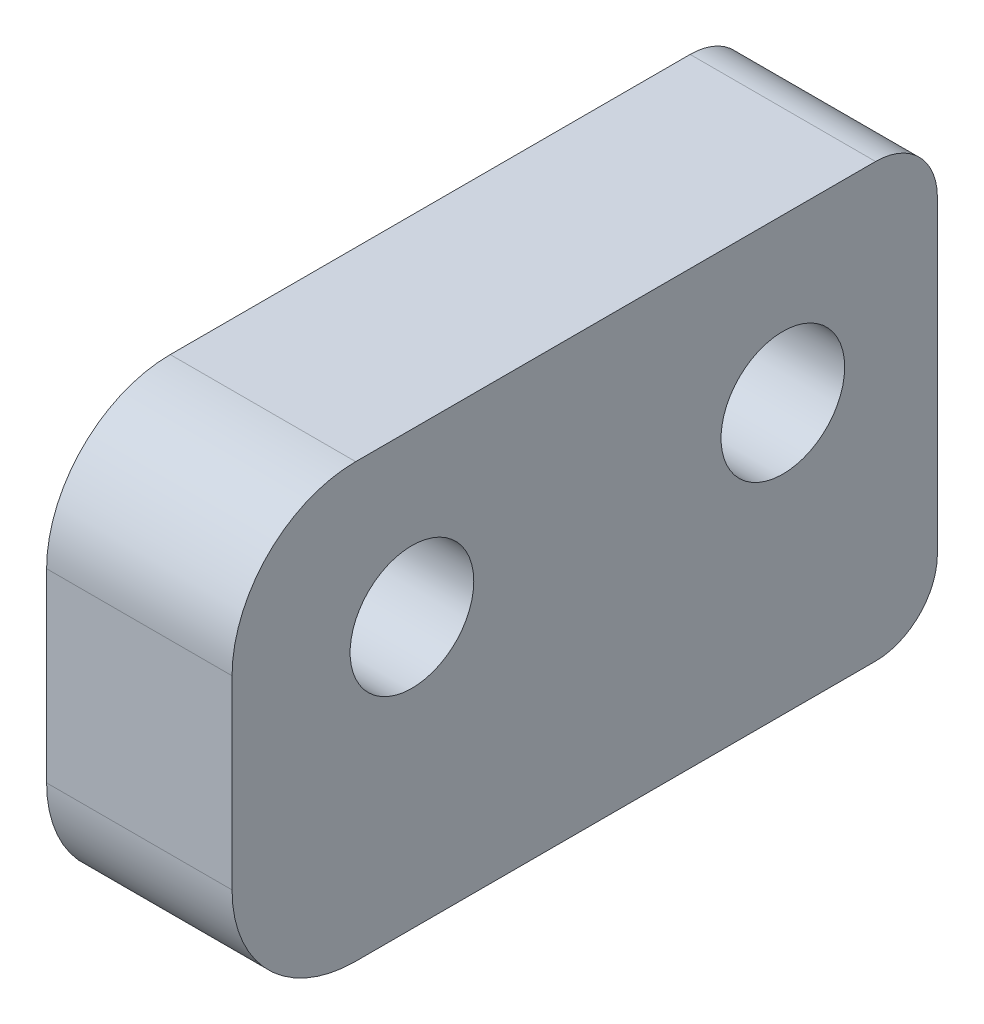
ISO-10303-21;
HEADER;
FILE_DESCRIPTION(('STEP AP214'),'2;1');
FILE_NAME('part.step','',(''),(''),'','','');
FILE_SCHEMA(('AUTOMOTIVE_DESIGN { 1 0 10303 214 1 1 1 1 }'));
ENDSEC;
DATA;
#1=APPLICATION_CONTEXT('core data for automotive mechanical design processes');
#2=APPLICATION_PROTOCOL_DEFINITION('international standard','automotive_design',2000,#1);
#3=PRODUCT_CONTEXT('',#1,'mechanical');
#4=PRODUCT('Part','Part','',(#3));
#5=PRODUCT_RELATED_PRODUCT_CATEGORY('part','',(#4));
#6=PRODUCT_DEFINITION_FORMATION('','',#4);
#7=PRODUCT_DEFINITION_CONTEXT('part definition',#1,'design');
#8=PRODUCT_DEFINITION('design','',#6,#7);
#9=PRODUCT_DEFINITION_SHAPE('','',#8);
#10=(LENGTH_UNIT() NAMED_UNIT(*) SI_UNIT(.MILLI.,.METRE.));
#11=(NAMED_UNIT(*) PLANE_ANGLE_UNIT() SI_UNIT($,.RADIAN.));
#12=(NAMED_UNIT(*) SI_UNIT($,.STERADIAN.) SOLID_ANGLE_UNIT());
#13=UNCERTAINTY_MEASURE_WITH_UNIT(LENGTH_MEASURE(1.E-05),#10,'distance_accuracy_value','');
#14=(GEOMETRIC_REPRESENTATION_CONTEXT(3) GLOBAL_UNCERTAINTY_ASSIGNED_CONTEXT((#13)) GLOBAL_UNIT_ASSIGNED_CONTEXT((#10,
#11,#12)) REPRESENTATION_CONTEXT('',''));
#15=CARTESIAN_POINT('',(0.,0.,0.));
#16=DIRECTION('',(0.,0.,1.));
#17=DIRECTION('',(1.,0.,0.));
#18=AXIS2_PLACEMENT_3D('',#15,#16,#17);
#19=CARTESIAN_POINT('',(-3.,2.63,1.86869594404836));
#20=DIRECTION('',(0.,1.,0.));
#21=DIRECTION('',(0.,0.,1.));
#22=AXIS2_PLACEMENT_3D('',#19,#20,#21);
#23=PLANE('',#22);
#24=DIRECTION('',(0.,0.,1.));
#25=VECTOR('',#24,1.);
#26=CARTESIAN_POINT('',(0.,2.63,1.86869594404836));
#27=LINE('',#26,#25);
#28=CARTESIAN_POINT('',(0.,2.63,-1.5));
#29=VERTEX_POINT('',#28);
#30=CARTESIAN_POINT('',(0.,2.63,6.91));
#31=VERTEX_POINT('',#30);
#32=EDGE_CURVE('E107',#29,#31,#27,.T.);
#33=ORIENTED_EDGE('',*,*,#32,.F.);
#34=DIRECTION('',(1.,0.,0.));
#35=VECTOR('',#34,1.);
#36=CARTESIAN_POINT('',(-3.,2.63,-1.5));
#37=LINE('',#36,#35);
#38=CARTESIAN_POINT('',(-3.,2.63,-1.5));
#39=VERTEX_POINT('',#38);
#40=EDGE_CURVE('E11',#29,#39,#37,.F.);
#41=ORIENTED_EDGE('',*,*,#40,.T.);
#42=DIRECTION('',(0.,0.,1.));
#43=VECTOR('',#42,1.);
#44=CARTESIAN_POINT('',(-3.,2.63,8.91));
#45=LINE('',#44,#43);
#46=CARTESIAN_POINT('',(-3.,2.63,6.91));
#47=VERTEX_POINT('',#46);
#48=EDGE_CURVE('E178',#39,#47,#45,.T.);
#49=ORIENTED_EDGE('',*,*,#48,.T.);
#50=DIRECTION('',(1.,0.,0.));
#51=VECTOR('',#50,1.);
#52=CARTESIAN_POINT('',(-3.,2.63,6.91));
#53=LINE('',#52,#51);
#54=EDGE_CURVE('E143',#47,#31,#53,.T.);
#55=ORIENTED_EDGE('',*,*,#54,.T.);
#56=EDGE_LOOP('',(#33,#41,#49,#55));
#57=FACE_BOUND('',#56,.T.);
#58=ADVANCED_FACE('F37',(#57),#23,.T.);
#59=CARTESIAN_POINT('',(-3.,2.63,-2.5));
#60=DIRECTION('',(0.,0.,-1.));
#61=DIRECTION('',(0.,1.,0.));
#62=AXIS2_PLACEMENT_3D('',#59,#60,#61);
#63=PLANE('',#62);
#64=DIRECTION('',(0.,1.,0.));
#65=VECTOR('',#64,1.);
#66=CARTESIAN_POINT('',(0.,2.63,-2.5));
#67=LINE('',#66,#65);
#68=CARTESIAN_POINT('',(0.,-3.37,-2.5));
#69=VERTEX_POINT('',#68);
#70=CARTESIAN_POINT('',(0.,1.63,-2.5));
#71=VERTEX_POINT('',#70);
#72=EDGE_CURVE('E174',#69,#71,#67,.T.);
#73=ORIENTED_EDGE('',*,*,#72,.F.);
#74=DIRECTION('',(1.,0.,0.));
#75=VECTOR('',#74,1.);
#76=CARTESIAN_POINT('',(-3.,-3.37,-2.5));
#77=LINE('',#76,#75);
#78=CARTESIAN_POINT('',(-3.,-3.37,-2.5));
#79=VERTEX_POINT('',#78);
#80=EDGE_CURVE('E155',#69,#79,#77,.F.);
#81=ORIENTED_EDGE('',*,*,#80,.T.);
#82=DIRECTION('',(0.,1.,0.));
#83=VECTOR('',#82,1.);
#84=CARTESIAN_POINT('',(-3.,2.63,-2.5));
#85=LINE('',#84,#83);
#86=CARTESIAN_POINT('',(-3.,1.63,-2.5));
#87=VERTEX_POINT('',#86);
#88=EDGE_CURVE('E129',#79,#87,#85,.T.);
#89=ORIENTED_EDGE('',*,*,#88,.T.);
#90=DIRECTION('',(1.,0.,0.));
#91=VECTOR('',#90,1.);
#92=CARTESIAN_POINT('',(-3.,1.63,-2.5));
#93=LINE('',#92,#91);
#94=EDGE_CURVE('E152',#87,#71,#93,.T.);
#95=ORIENTED_EDGE('',*,*,#94,.T.);
#96=EDGE_LOOP('',(#73,#81,#89,#95));
#97=FACE_BOUND('',#96,.T.);
#98=ADVANCED_FACE('F176',(#97),#63,.T.);
#99=CARTESIAN_POINT('',(-3.,-4.37,-2.5));
#100=DIRECTION('',(0.,-1.,0.));
#101=DIRECTION('',(0.,0.,-1.));
#102=AXIS2_PLACEMENT_3D('',#99,#100,#101);
#103=PLANE('',#102);
#104=DIRECTION('',(0.,0.,-1.));
#105=VECTOR('',#104,1.);
#106=CARTESIAN_POINT('',(-3.,-4.37,-2.5));
#107=LINE('',#106,#105);
#108=CARTESIAN_POINT('',(-3.,-4.37,6.91));
#109=VERTEX_POINT('',#108);
#110=CARTESIAN_POINT('',(-3.,-4.37,-1.5));
#111=VERTEX_POINT('',#110);
#112=EDGE_CURVE('E132',#109,#111,#107,.T.);
#113=ORIENTED_EDGE('',*,*,#112,.T.);
#114=DIRECTION('',(1.,0.,0.));
#115=VECTOR('',#114,1.);
#116=CARTESIAN_POINT('',(-3.,-4.37,-1.5));
#117=LINE('',#116,#115);
#118=CARTESIAN_POINT('',(0.,-4.37,-1.5));
#119=VERTEX_POINT('',#118);
#120=EDGE_CURVE('E145',#111,#119,#117,.T.);
#121=ORIENTED_EDGE('',*,*,#120,.T.);
#122=DIRECTION('',(0.,0.,-1.));
#123=VECTOR('',#122,1.);
#124=CARTESIAN_POINT('',(0.,-4.37,-2.5));
#125=LINE('',#124,#123);
#126=CARTESIAN_POINT('',(0.,-4.37,6.91));
#127=VERTEX_POINT('',#126);
#128=EDGE_CURVE('E122',#127,#119,#125,.T.);
#129=ORIENTED_EDGE('',*,*,#128,.F.);
#130=DIRECTION('',(1.,0.,0.));
#131=VECTOR('',#130,1.);
#132=CARTESIAN_POINT('',(-3.,-4.37,6.91));
#133=LINE('',#132,#131);
#134=EDGE_CURVE('E138',#127,#109,#133,.F.);
#135=ORIENTED_EDGE('',*,*,#134,.T.);
#136=EDGE_LOOP('',(#113,#121,#129,#135));
#137=FACE_BOUND('',#136,.T.);
#138=ADVANCED_FACE('F166',(#137),#103,.T.);
#139=CARTESIAN_POINT('',(-3.,-4.37,8.91));
#140=DIRECTION('',(0.,0.,1.));
#141=DIRECTION('',(1.,0.,0.));
#142=AXIS2_PLACEMENT_3D('',#139,#140,#141);
#143=PLANE('',#142);
#144=DIRECTION('',(0.,-1.,0.));
#145=VECTOR('',#144,1.);
#146=CARTESIAN_POINT('',(-3.,-4.37,8.91));
#147=LINE('',#146,#145);
#148=CARTESIAN_POINT('',(-3.,0.629999999999999,8.91));
#149=VERTEX_POINT('',#148);
#150=CARTESIAN_POINT('',(-3.,-2.37,8.91));
#151=VERTEX_POINT('',#150);
#152=EDGE_CURVE('E169',#149,#151,#147,.T.);
#153=ORIENTED_EDGE('',*,*,#152,.T.);
#154=DIRECTION('',(1.,0.,0.));
#155=VECTOR('',#154,1.);
#156=CARTESIAN_POINT('',(-3.,-2.37,8.91));
#157=LINE('',#156,#155);
#158=CARTESIAN_POINT('',(0.,-2.37,8.91));
#159=VERTEX_POINT('',#158);
#160=EDGE_CURVE('E113',#151,#159,#157,.T.);
#161=ORIENTED_EDGE('',*,*,#160,.T.);
#162=DIRECTION('',(0.,-1.,0.));
#163=VECTOR('',#162,1.);
#164=CARTESIAN_POINT('',(0.,-4.37,8.91));
#165=LINE('',#164,#163);
#166=CARTESIAN_POINT('',(0.,0.629999999999999,8.91));
#167=VERTEX_POINT('',#166);
#168=EDGE_CURVE('E106',#167,#159,#165,.T.);
#169=ORIENTED_EDGE('',*,*,#168,.F.);
#170=DIRECTION('',(1.,0.,0.));
#171=VECTOR('',#170,1.);
#172=CARTESIAN_POINT('',(-3.,0.629999999999999,8.91));
#173=LINE('',#172,#171);
#174=EDGE_CURVE('E119',#167,#149,#173,.F.);
#175=ORIENTED_EDGE('',*,*,#174,.T.);
#176=EDGE_LOOP('',(#153,#161,#169,#175));
#177=FACE_BOUND('',#176,.T.);
#178=ADVANCED_FACE('F118',(#177),#143,.T.);
#179=CARTESIAN_POINT('',(-3.,0.,0.));
#180=DIRECTION('',(-1.,0.,0.));
#181=DIRECTION('',(0.,0.,1.));
#182=AXIS2_PLACEMENT_3D('',#179,#180,#181);
#183=PLANE('',#182);
#184=CARTESIAN_POINT('',(-3.,0.,6.));
#185=DIRECTION('',(1.,0.,0.));
#186=DIRECTION('',(0.,0.,-1.));
#187=AXIS2_PLACEMENT_3D('',#184,#185,#186);
#188=CIRCLE('',#187,1.);
#189=CARTESIAN_POINT('',(-3.,0.,5.));
#190=VERTEX_POINT('',#189);
#191=EDGE_CURVE('E186',#190,#190,#188,.T.);
#192=ORIENTED_EDGE('',*,*,#191,.T.);
#193=EDGE_LOOP('',(#192));
#194=FACE_BOUND('',#193,.T.);
#195=CARTESIAN_POINT('',(-3.,0.,0.));
#196=DIRECTION('',(1.,0.,0.));
#197=DIRECTION('',(0.,0.,-1.));
#198=AXIS2_PLACEMENT_3D('',#195,#196,#197);
#199=CIRCLE('',#198,1.);
#200=CARTESIAN_POINT('',(-3.,0.,-1.));
#201=VERTEX_POINT('',#200);
#202=EDGE_CURVE('E123',#201,#201,#199,.T.);
#203=ORIENTED_EDGE('',*,*,#202,.T.);
#204=EDGE_LOOP('',(#203));
#205=FACE_BOUND('',#204,.T.);
#206=ORIENTED_EDGE('',*,*,#88,.F.);
#207=CARTESIAN_POINT('',(-3.,-3.37,-1.5));
#208=DIRECTION('',(-1.,0.,0.));
#209=DIRECTION('',(0.,0.,1.));
#210=AXIS2_PLACEMENT_3D('',#207,#208,#209);
#211=CIRCLE('',#210,1.);
#212=EDGE_CURVE('E45',#79,#111,#211,.T.);
#213=ORIENTED_EDGE('',*,*,#212,.T.);
#214=ORIENTED_EDGE('',*,*,#112,.F.);
#215=CARTESIAN_POINT('',(-3.,-2.37,6.91));
#216=DIRECTION('',(-1.,0.,0.));
#217=DIRECTION('',(0.,0.,1.));
#218=AXIS2_PLACEMENT_3D('',#215,#216,#217);
#219=CIRCLE('',#218,2.);
#220=EDGE_CURVE('E141',#109,#151,#219,.T.);
#221=ORIENTED_EDGE('',*,*,#220,.T.);
#222=ORIENTED_EDGE('',*,*,#152,.F.);
#223=CARTESIAN_POINT('',(-3.,0.63,6.91));
#224=DIRECTION('',(-1.,0.,0.));
#225=DIRECTION('',(0.,0.,1.));
#226=AXIS2_PLACEMENT_3D('',#223,#224,#225);
#227=CIRCLE('',#226,2.);
#228=EDGE_CURVE('E128',#149,#47,#227,.T.);
#229=ORIENTED_EDGE('',*,*,#228,.T.);
#230=ORIENTED_EDGE('',*,*,#48,.F.);
#231=CARTESIAN_POINT('',(-3.,1.63,-1.5));
#232=DIRECTION('',(-1.,0.,0.));
#233=DIRECTION('',(0.,0.,1.));
#234=AXIS2_PLACEMENT_3D('',#231,#232,#233);
#235=CIRCLE('',#234,1.);
#236=EDGE_CURVE('E57',#39,#87,#235,.T.);
#237=ORIENTED_EDGE('',*,*,#236,.T.);
#238=EDGE_LOOP('',(#206,#213,#214,#221,#222,#229,#230,#237));
#239=FACE_BOUND('',#238,.T.);
#240=ADVANCED_FACE('F160',(#194,#205,#239),#183,.T.);
#241=CARTESIAN_POINT('',(0.,0.,0.));
#242=DIRECTION('',(-1.,0.,0.));
#243=DIRECTION('',(0.,0.,1.));
#244=AXIS2_PLACEMENT_3D('',#241,#242,#243);
#245=PLANE('',#244);
#246=CARTESIAN_POINT('',(0.,0.,6.));
#247=DIRECTION('',(1.,0.,0.));
#248=DIRECTION('',(0.,0.,-1.));
#249=AXIS2_PLACEMENT_3D('',#246,#247,#248);
#250=CIRCLE('',#249,1.);
#251=CARTESIAN_POINT('',(0.,0.,5.));
#252=VERTEX_POINT('',#251);
#253=EDGE_CURVE('E189',#252,#252,#250,.T.);
#254=ORIENTED_EDGE('',*,*,#253,.F.);
#255=EDGE_LOOP('',(#254));
#256=FACE_BOUND('',#255,.T.);
#257=CARTESIAN_POINT('',(0.,0.,0.));
#258=DIRECTION('',(1.,0.,0.));
#259=DIRECTION('',(0.,0.,-1.));
#260=AXIS2_PLACEMENT_3D('',#257,#258,#259);
#261=CIRCLE('',#260,1.);
#262=CARTESIAN_POINT('',(0.,0.,-1.));
#263=VERTEX_POINT('',#262);
#264=EDGE_CURVE('E183',#263,#263,#261,.T.);
#265=ORIENTED_EDGE('',*,*,#264,.F.);
#266=EDGE_LOOP('',(#265));
#267=FACE_BOUND('',#266,.T.);
#268=ORIENTED_EDGE('',*,*,#128,.T.);
#269=CARTESIAN_POINT('',(0.,-3.37,-1.5));
#270=DIRECTION('',(-1.,0.,0.));
#271=DIRECTION('',(0.,0.,1.));
#272=AXIS2_PLACEMENT_3D('',#269,#270,#271);
#273=CIRCLE('',#272,1.);
#274=EDGE_CURVE('E150',#119,#69,#273,.F.);
#275=ORIENTED_EDGE('',*,*,#274,.T.);
#276=ORIENTED_EDGE('',*,*,#72,.T.);
#277=CARTESIAN_POINT('',(0.,1.63,-1.5));
#278=DIRECTION('',(-1.,0.,0.));
#279=DIRECTION('',(0.,0.,1.));
#280=AXIS2_PLACEMENT_3D('',#277,#278,#279);
#281=CIRCLE('',#280,1.);
#282=EDGE_CURVE('E148',#71,#29,#281,.F.);
#283=ORIENTED_EDGE('',*,*,#282,.T.);
#284=ORIENTED_EDGE('',*,*,#32,.T.);
#285=CARTESIAN_POINT('',(0.,0.63,6.91));
#286=DIRECTION('',(-1.,0.,0.));
#287=DIRECTION('',(0.,0.,1.));
#288=AXIS2_PLACEMENT_3D('',#285,#286,#287);
#289=CIRCLE('',#288,2.);
#290=EDGE_CURVE('E102',#31,#167,#289,.F.);
#291=ORIENTED_EDGE('',*,*,#290,.T.);
#292=ORIENTED_EDGE('',*,*,#168,.T.);
#293=CARTESIAN_POINT('',(0.,-2.37,6.91));
#294=DIRECTION('',(-1.,0.,0.));
#295=DIRECTION('',(0.,0.,1.));
#296=AXIS2_PLACEMENT_3D('',#293,#294,#295);
#297=CIRCLE('',#296,2.);
#298=EDGE_CURVE('E112',#159,#127,#297,.F.);
#299=ORIENTED_EDGE('',*,*,#298,.T.);
#300=EDGE_LOOP('',(#268,#275,#276,#283,#284,#291,#292,#299));
#301=FACE_BOUND('',#300,.T.);
#302=ADVANCED_FACE('F105',(#256,#267,#301),#245,.F.);
#303=CARTESIAN_POINT('',(-3.,0.,0.));
#304=DIRECTION('',(1.,0.,0.));
#305=DIRECTION('',(0.,0.,-1.));
#306=AXIS2_PLACEMENT_3D('',#303,#304,#305);
#307=CYLINDRICAL_SURFACE('',#306,1.);
#308=ORIENTED_EDGE('',*,*,#202,.F.);
#309=EDGE_LOOP('',(#308));
#310=FACE_BOUND('',#309,.T.);
#311=ORIENTED_EDGE('',*,*,#264,.T.);
#312=EDGE_LOOP('',(#311));
#313=FACE_BOUND('',#312,.T.);
#314=ADVANCED_FACE('F201',(#310,#313),#307,.F.);
#315=CARTESIAN_POINT('',(-3.,0.,6.));
#316=DIRECTION('',(1.,0.,0.));
#317=DIRECTION('',(0.,0.,-1.));
#318=AXIS2_PLACEMENT_3D('',#315,#316,#317);
#319=CYLINDRICAL_SURFACE('',#318,1.);
#320=ORIENTED_EDGE('',*,*,#191,.F.);
#321=EDGE_LOOP('',(#320));
#322=FACE_BOUND('',#321,.T.);
#323=ORIENTED_EDGE('',*,*,#253,.T.);
#324=EDGE_LOOP('',(#323));
#325=FACE_BOUND('',#324,.T.);
#326=ADVANCED_FACE('F197',(#322,#325),#319,.F.);
#327=CARTESIAN_POINT('',(-3.,-2.37,6.91));
#328=DIRECTION('',(1.,0.,0.));
#329=DIRECTION('',(0.,0.,-1.));
#330=AXIS2_PLACEMENT_3D('',#327,#328,#329);
#331=CYLINDRICAL_SURFACE('',#330,2.);
#332=ORIENTED_EDGE('',*,*,#220,.F.);
#333=ORIENTED_EDGE('',*,*,#134,.F.);
#334=ORIENTED_EDGE('',*,*,#298,.F.);
#335=ORIENTED_EDGE('',*,*,#160,.F.);
#336=EDGE_LOOP('',(#332,#333,#334,#335));
#337=FACE_BOUND('',#336,.T.);
#338=ADVANCED_FACE('F200',(#337),#331,.T.);
#339=CARTESIAN_POINT('',(-3.,0.63,6.91));
#340=DIRECTION('',(1.,0.,0.));
#341=DIRECTION('',(0.,0.,-1.));
#342=AXIS2_PLACEMENT_3D('',#339,#340,#341);
#343=CYLINDRICAL_SURFACE('',#342,2.);
#344=ORIENTED_EDGE('',*,*,#228,.F.);
#345=ORIENTED_EDGE('',*,*,#174,.F.);
#346=ORIENTED_EDGE('',*,*,#290,.F.);
#347=ORIENTED_EDGE('',*,*,#54,.F.);
#348=EDGE_LOOP('',(#344,#345,#346,#347));
#349=FACE_BOUND('',#348,.T.);
#350=ADVANCED_FACE('F126',(#349),#343,.T.);
#351=CARTESIAN_POINT('',(-3.,-3.37,-1.5));
#352=DIRECTION('',(1.,0.,0.));
#353=DIRECTION('',(0.,0.,-1.));
#354=AXIS2_PLACEMENT_3D('',#351,#352,#353);
#355=CYLINDRICAL_SURFACE('',#354,1.);
#356=ORIENTED_EDGE('',*,*,#212,.F.);
#357=ORIENTED_EDGE('',*,*,#80,.F.);
#358=ORIENTED_EDGE('',*,*,#274,.F.);
#359=ORIENTED_EDGE('',*,*,#120,.F.);
#360=EDGE_LOOP('',(#356,#357,#358,#359));
#361=FACE_BOUND('',#360,.T.);
#362=ADVANCED_FACE('F171',(#361),#355,.T.);
#363=CARTESIAN_POINT('',(-3.,1.63,-1.5));
#364=DIRECTION('',(1.,0.,0.));
#365=DIRECTION('',(0.,0.,-1.));
#366=AXIS2_PLACEMENT_3D('',#363,#364,#365);
#367=CYLINDRICAL_SURFACE('',#366,1.);
#368=ORIENTED_EDGE('',*,*,#236,.F.);
#369=ORIENTED_EDGE('',*,*,#40,.F.);
#370=ORIENTED_EDGE('',*,*,#282,.F.);
#371=ORIENTED_EDGE('',*,*,#94,.F.);
#372=EDGE_LOOP('',(#368,#369,#370,#371));
#373=FACE_BOUND('',#372,.T.);
#374=ADVANCED_FACE('F39',(#373),#367,.T.);
#375=CLOSED_SHELL('',(#58,#98,#138,#178,#240,#302,#314,#326,#338,#350,#362,#374));
#376=MANIFOLD_SOLID_BREP('B2',#375);
#377=ADVANCED_BREP_SHAPE_REPRESENTATION('',(#18,#376),#14);
#378=SHAPE_DEFINITION_REPRESENTATION(#9,#377);
ENDSEC;
END-ISO-10303-21;
